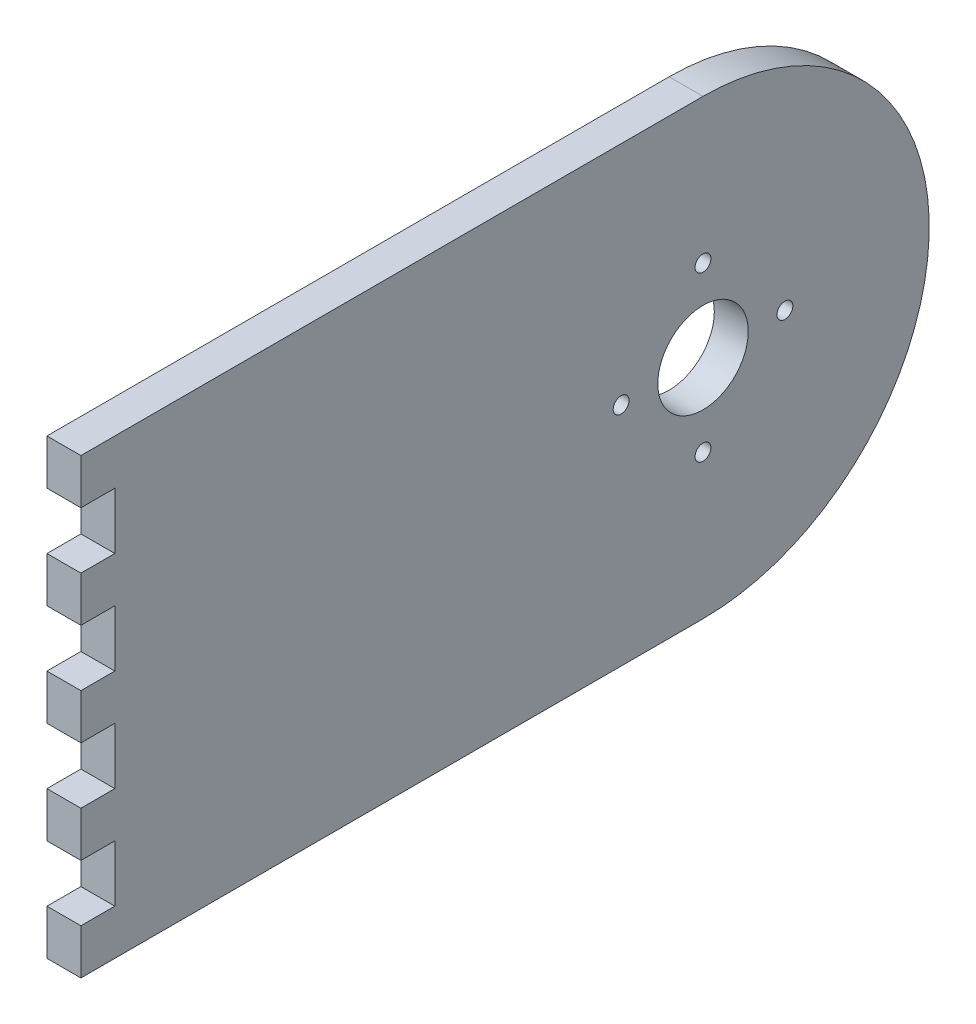
ISO-10303-21;
HEADER;
FILE_DESCRIPTION(('STEP AP214'),'2;1');
FILE_NAME('part.step','',(''),(''),'','','');
FILE_SCHEMA(('AUTOMOTIVE_DESIGN { 1 0 10303 214 1 1 1 1 }'));
ENDSEC;
DATA;
#1=APPLICATION_CONTEXT('core data for automotive mechanical design processes');
#2=APPLICATION_PROTOCOL_DEFINITION('international standard','automotive_design',2000,#1);
#3=PRODUCT_CONTEXT('',#1,'mechanical');
#4=PRODUCT('Part','Part','',(#3));
#5=PRODUCT_RELATED_PRODUCT_CATEGORY('part','',(#4));
#6=PRODUCT_DEFINITION_FORMATION('','',#4);
#7=PRODUCT_DEFINITION_CONTEXT('part definition',#1,'design');
#8=PRODUCT_DEFINITION('design','',#6,#7);
#9=PRODUCT_DEFINITION_SHAPE('','',#8);
#10=(LENGTH_UNIT() NAMED_UNIT(*) SI_UNIT(.MILLI.,.METRE.));
#11=(NAMED_UNIT(*) PLANE_ANGLE_UNIT() SI_UNIT($,.RADIAN.));
#12=(NAMED_UNIT(*) SI_UNIT($,.STERADIAN.) SOLID_ANGLE_UNIT());
#13=UNCERTAINTY_MEASURE_WITH_UNIT(LENGTH_MEASURE(1.E-05),#10,'distance_accuracy_value','');
#14=(GEOMETRIC_REPRESENTATION_CONTEXT(3) GLOBAL_UNCERTAINTY_ASSIGNED_CONTEXT((#13)) GLOBAL_UNIT_ASSIGNED_CONTEXT((#10,
#11,#12)) REPRESENTATION_CONTEXT('',''));
#15=CARTESIAN_POINT('',(0.,0.,0.));
#16=DIRECTION('',(0.,0.,1.));
#17=DIRECTION('',(1.,0.,0.));
#18=AXIS2_PLACEMENT_3D('',#15,#16,#17);
#19=CARTESIAN_POINT('',(3.,0.,0.));
#20=DIRECTION('',(1.,0.,0.));
#21=DIRECTION('',(0.,0.,-1.));
#22=AXIS2_PLACEMENT_3D('',#19,#20,#21);
#23=PLANE('',#22);
#24=CARTESIAN_POINT('',(3.,0.,-7.24));
#25=DIRECTION('',(1.,0.,0.));
#26=DIRECTION('',(0.,0.,-1.));
#27=AXIS2_PLACEMENT_3D('',#24,#25,#26);
#28=CIRCLE('',#27,0.700000000000001);
#29=CARTESIAN_POINT('',(3.,0.,-7.94));
#30=VERTEX_POINT('',#29);
#31=EDGE_CURVE('E400',#30,#30,#28,.T.);
#32=ORIENTED_EDGE('',*,*,#31,.F.);
#33=EDGE_LOOP('',(#32));
#34=FACE_BOUND('',#33,.T.);
#35=CARTESIAN_POINT('',(3.,0.,7.24));
#36=DIRECTION('',(1.,0.,0.));
#37=DIRECTION('',(0.,0.,-1.));
#38=AXIS2_PLACEMENT_3D('',#35,#36,#37);
#39=CIRCLE('',#38,0.7);
#40=CARTESIAN_POINT('',(3.,0.,6.54));
#41=VERTEX_POINT('',#40);
#42=EDGE_CURVE('E412',#41,#41,#39,.T.);
#43=ORIENTED_EDGE('',*,*,#42,.F.);
#44=EDGE_LOOP('',(#43));
#45=FACE_BOUND('',#44,.T.);
#46=DIRECTION('',(0.,0.,-1.));
#47=VECTOR('',#46,1.);
#48=CARTESIAN_POINT('',(3.,16.,55.));
#49=LINE('',#48,#47);
#50=CARTESIAN_POINT('',(3.,16.,55.));
#51=VERTEX_POINT('',#50);
#52=CARTESIAN_POINT('',(3.,16.,52.));
#53=VERTEX_POINT('',#52);
#54=EDGE_CURVE('E241',#51,#53,#49,.T.);
#55=ORIENTED_EDGE('',*,*,#54,.T.);
#56=DIRECTION('',(0.,-1.,0.));
#57=VECTOR('',#56,1.);
#58=CARTESIAN_POINT('',(3.,16.,52.));
#59=LINE('',#58,#57);
#60=CARTESIAN_POINT('',(3.,11.,52.));
#61=VERTEX_POINT('',#60);
#62=EDGE_CURVE('E129',#53,#61,#59,.T.);
#63=ORIENTED_EDGE('',*,*,#62,.T.);
#64=DIRECTION('',(0.,0.,1.));
#65=VECTOR('',#64,1.);
#66=CARTESIAN_POINT('',(3.,11.,52.));
#67=LINE('',#66,#65);
#68=CARTESIAN_POINT('',(3.,11.,55.));
#69=VERTEX_POINT('',#68);
#70=EDGE_CURVE('E292',#61,#69,#67,.T.);
#71=ORIENTED_EDGE('',*,*,#70,.T.);
#72=DIRECTION('',(0.,-1.,0.));
#73=VECTOR('',#72,1.);
#74=CARTESIAN_POINT('',(3.,11.,55.));
#75=LINE('',#74,#73);
#76=CARTESIAN_POINT('',(3.,7.,55.));
#77=VERTEX_POINT('',#76);
#78=EDGE_CURVE('E311',#69,#77,#75,.T.);
#79=ORIENTED_EDGE('',*,*,#78,.T.);
#80=DIRECTION('',(0.,0.,-1.));
#81=VECTOR('',#80,1.);
#82=CARTESIAN_POINT('',(3.,7.,55.));
#83=LINE('',#82,#81);
#84=CARTESIAN_POINT('',(3.,7.,52.));
#85=VERTEX_POINT('',#84);
#86=EDGE_CURVE('E308',#77,#85,#83,.T.);
#87=ORIENTED_EDGE('',*,*,#86,.T.);
#88=DIRECTION('',(0.,-1.,0.));
#89=VECTOR('',#88,1.);
#90=CARTESIAN_POINT('',(3.,7.,52.));
#91=LINE('',#90,#89);
#92=CARTESIAN_POINT('',(3.,2.,52.));
#93=VERTEX_POINT('',#92);
#94=EDGE_CURVE('E310',#85,#93,#91,.T.);
#95=ORIENTED_EDGE('',*,*,#94,.T.);
#96=DIRECTION('',(0.,0.,1.));
#97=VECTOR('',#96,1.);
#98=CARTESIAN_POINT('',(3.,2.,52.));
#99=LINE('',#98,#97);
#100=CARTESIAN_POINT('',(3.,2.,55.));
#101=VERTEX_POINT('',#100);
#102=EDGE_CURVE('E313',#93,#101,#99,.T.);
#103=ORIENTED_EDGE('',*,*,#102,.T.);
#104=DIRECTION('',(0.,-1.,0.));
#105=VECTOR('',#104,1.);
#106=CARTESIAN_POINT('',(3.,2.,55.));
#107=LINE('',#106,#105);
#108=CARTESIAN_POINT('',(3.,-2.,55.));
#109=VERTEX_POINT('',#108);
#110=EDGE_CURVE('E319',#101,#109,#107,.T.);
#111=ORIENTED_EDGE('',*,*,#110,.T.);
#112=DIRECTION('',(0.,0.,-1.));
#113=VECTOR('',#112,1.);
#114=CARTESIAN_POINT('',(3.,-2.,52.));
#115=LINE('',#114,#113);
#116=CARTESIAN_POINT('',(3.,-2.,52.));
#117=VERTEX_POINT('',#116);
#118=EDGE_CURVE('E321',#109,#117,#115,.T.);
#119=ORIENTED_EDGE('',*,*,#118,.T.);
#120=DIRECTION('',(0.,-1.,0.));
#121=VECTOR('',#120,1.);
#122=CARTESIAN_POINT('',(3.,-7.,52.));
#123=LINE('',#122,#121);
#124=CARTESIAN_POINT('',(3.,-7.,52.));
#125=VERTEX_POINT('',#124);
#126=EDGE_CURVE('E323',#117,#125,#123,.T.);
#127=ORIENTED_EDGE('',*,*,#126,.T.);
#128=DIRECTION('',(0.,0.,1.));
#129=VECTOR('',#128,1.);
#130=CARTESIAN_POINT('',(3.,-7.,55.));
#131=LINE('',#130,#129);
#132=CARTESIAN_POINT('',(3.,-7.,55.));
#133=VERTEX_POINT('',#132);
#134=EDGE_CURVE('E325',#125,#133,#131,.T.);
#135=ORIENTED_EDGE('',*,*,#134,.T.);
#136=DIRECTION('',(0.,-1.,0.));
#137=VECTOR('',#136,1.);
#138=CARTESIAN_POINT('',(3.,-7.,55.));
#139=LINE('',#138,#137);
#140=CARTESIAN_POINT('',(3.,-11.,55.));
#141=VERTEX_POINT('',#140);
#142=EDGE_CURVE('E327',#133,#141,#139,.T.);
#143=ORIENTED_EDGE('',*,*,#142,.T.);
#144=DIRECTION('',(0.,0.,-1.));
#145=VECTOR('',#144,1.);
#146=CARTESIAN_POINT('',(3.,-11.,52.));
#147=LINE('',#146,#145);
#148=CARTESIAN_POINT('',(3.,-11.,52.));
#149=VERTEX_POINT('',#148);
#150=EDGE_CURVE('E329',#141,#149,#147,.T.);
#151=ORIENTED_EDGE('',*,*,#150,.T.);
#152=DIRECTION('',(0.,-1.,0.));
#153=VECTOR('',#152,1.);
#154=CARTESIAN_POINT('',(3.,-16.,52.));
#155=LINE('',#154,#153);
#156=CARTESIAN_POINT('',(3.,-16.,52.));
#157=VERTEX_POINT('',#156);
#158=EDGE_CURVE('E331',#149,#157,#155,.T.);
#159=ORIENTED_EDGE('',*,*,#158,.T.);
#160=DIRECTION('',(0.,0.,1.));
#161=VECTOR('',#160,1.);
#162=CARTESIAN_POINT('',(3.,-16.,55.));
#163=LINE('',#162,#161);
#164=CARTESIAN_POINT('',(3.,-16.,55.));
#165=VERTEX_POINT('',#164);
#166=EDGE_CURVE('E333',#157,#165,#163,.T.);
#167=ORIENTED_EDGE('',*,*,#166,.T.);
#168=DIRECTION('',(0.,-1.,0.));
#169=VECTOR('',#168,1.);
#170=CARTESIAN_POINT('',(3.,-16.,55.));
#171=LINE('',#170,#169);
#172=CARTESIAN_POINT('',(3.,-20.,55.));
#173=VERTEX_POINT('',#172);
#174=EDGE_CURVE('E335',#165,#173,#171,.T.);
#175=ORIENTED_EDGE('',*,*,#174,.T.);
#176=DIRECTION('',(0.,0.,-1.));
#177=VECTOR('',#176,1.);
#178=CARTESIAN_POINT('',(3.,-20.,55.));
#179=LINE('',#178,#177);
#180=CARTESIAN_POINT('',(3.,-20.,0.));
#181=VERTEX_POINT('',#180);
#182=EDGE_CURVE('E184',#173,#181,#179,.T.);
#183=ORIENTED_EDGE('',*,*,#182,.T.);
#184=CARTESIAN_POINT('',(3.,0.,0.));
#185=DIRECTION('',(1.,0.,0.));
#186=DIRECTION('',(0.,0.,-1.));
#187=AXIS2_PLACEMENT_3D('',#184,#185,#186);
#188=CIRCLE('',#187,20.);
#189=CARTESIAN_POINT('',(3.,20.,0.));
#190=VERTEX_POINT('',#189);
#191=EDGE_CURVE('E178',#181,#190,#188,.T.);
#192=ORIENTED_EDGE('',*,*,#191,.T.);
#193=DIRECTION('',(0.,0.,1.));
#194=VECTOR('',#193,1.);
#195=CARTESIAN_POINT('',(3.,20.,0.));
#196=LINE('',#195,#194);
#197=CARTESIAN_POINT('',(3.,20.,55.));
#198=VERTEX_POINT('',#197);
#199=EDGE_CURVE('E182',#190,#198,#196,.T.);
#200=ORIENTED_EDGE('',*,*,#199,.T.);
#201=DIRECTION('',(0.,-1.,0.));
#202=VECTOR('',#201,1.);
#203=CARTESIAN_POINT('',(3.,20.,55.));
#204=LINE('',#203,#202);
#205=EDGE_CURVE('E50',#198,#51,#204,.T.);
#206=ORIENTED_EDGE('',*,*,#205,.T.);
#207=EDGE_LOOP('',(#55,#63,#71,#79,#87,#95,#103,#111,#119,#127,#135,#143,#151,#159,#167,#175,
#183,#192,#200,#206));
#208=FACE_BOUND('',#207,.T.);
#209=CARTESIAN_POINT('',(3.,0.,0.));
#210=DIRECTION('',(1.,0.,0.));
#211=DIRECTION('',(0.,0.,-1.));
#212=AXIS2_PLACEMENT_3D('',#209,#210,#211);
#213=CIRCLE('',#212,4.);
#214=CARTESIAN_POINT('',(3.,0.,-4.));
#215=VERTEX_POINT('',#214);
#216=EDGE_CURVE('E206',#215,#215,#213,.T.);
#217=ORIENTED_EDGE('',*,*,#216,.F.);
#218=EDGE_LOOP('',(#217));
#219=FACE_BOUND('',#218,.T.);
#220=CARTESIAN_POINT('',(3.,7.24,0.));
#221=DIRECTION('',(1.,0.,0.));
#222=DIRECTION('',(0.,0.,-1.));
#223=AXIS2_PLACEMENT_3D('',#220,#221,#222);
#224=CIRCLE('',#223,0.7);
#225=CARTESIAN_POINT('',(3.,7.24,-0.699999999999999));
#226=VERTEX_POINT('',#225);
#227=EDGE_CURVE('E406',#226,#226,#224,.T.);
#228=ORIENTED_EDGE('',*,*,#227,.F.);
#229=EDGE_LOOP('',(#228));
#230=FACE_BOUND('',#229,.T.);
#231=CARTESIAN_POINT('',(3.,-7.24,0.));
#232=DIRECTION('',(1.,0.,0.));
#233=DIRECTION('',(0.,0.,-1.));
#234=AXIS2_PLACEMENT_3D('',#231,#232,#233);
#235=CIRCLE('',#234,0.7);
#236=CARTESIAN_POINT('',(3.,-7.24,-0.700000000000001));
#237=VERTEX_POINT('',#236);
#238=EDGE_CURVE('E391',#237,#237,#235,.T.);
#239=ORIENTED_EDGE('',*,*,#238,.F.);
#240=EDGE_LOOP('',(#239));
#241=FACE_BOUND('',#240,.T.);
#242=ADVANCED_FACE('F33',(#34,#45,#208,#219,#230,#241),#23,.T.);
#243=CARTESIAN_POINT('',(0.,0.,0.));
#244=DIRECTION('',(1.,0.,0.));
#245=DIRECTION('',(0.,0.,-1.));
#246=AXIS2_PLACEMENT_3D('',#243,#244,#245);
#247=PLANE('',#246);
#248=CARTESIAN_POINT('',(0.,0.,-7.24));
#249=DIRECTION('',(1.,0.,0.));
#250=DIRECTION('',(0.,0.,-1.));
#251=AXIS2_PLACEMENT_3D('',#248,#249,#250);
#252=CIRCLE('',#251,0.700000000000001);
#253=CARTESIAN_POINT('',(0.,0.,-7.94));
#254=VERTEX_POINT('',#253);
#255=EDGE_CURVE('E397',#254,#254,#252,.T.);
#256=ORIENTED_EDGE('',*,*,#255,.T.);
#257=EDGE_LOOP('',(#256));
#258=FACE_BOUND('',#257,.T.);
#259=CARTESIAN_POINT('',(0.,0.,7.24));
#260=DIRECTION('',(1.,0.,0.));
#261=DIRECTION('',(0.,0.,-1.));
#262=AXIS2_PLACEMENT_3D('',#259,#260,#261);
#263=CIRCLE('',#262,0.7);
#264=CARTESIAN_POINT('',(0.,0.,6.54));
#265=VERTEX_POINT('',#264);
#266=EDGE_CURVE('E409',#265,#265,#263,.T.);
#267=ORIENTED_EDGE('',*,*,#266,.T.);
#268=EDGE_LOOP('',(#267));
#269=FACE_BOUND('',#268,.T.);
#270=DIRECTION('',(0.,0.,-1.));
#271=VECTOR('',#270,1.);
#272=CARTESIAN_POINT('',(0.,16.,55.));
#273=LINE('',#272,#271);
#274=CARTESIAN_POINT('',(0.,16.,55.));
#275=VERTEX_POINT('',#274);
#276=CARTESIAN_POINT('',(0.,16.,52.));
#277=VERTEX_POINT('',#276);
#278=EDGE_CURVE('E202',#275,#277,#273,.T.);
#279=ORIENTED_EDGE('',*,*,#278,.F.);
#280=DIRECTION('',(0.,-1.,0.));
#281=VECTOR('',#280,1.);
#282=CARTESIAN_POINT('',(0.,20.,55.));
#283=LINE('',#282,#281);
#284=CARTESIAN_POINT('',(0.,20.,55.));
#285=VERTEX_POINT('',#284);
#286=EDGE_CURVE('E121',#285,#275,#283,.T.);
#287=ORIENTED_EDGE('',*,*,#286,.F.);
#288=DIRECTION('',(0.,0.,1.));
#289=VECTOR('',#288,1.);
#290=CARTESIAN_POINT('',(0.,20.,0.));
#291=LINE('',#290,#289);
#292=CARTESIAN_POINT('',(0.,20.,0.));
#293=VERTEX_POINT('',#292);
#294=EDGE_CURVE('E115',#293,#285,#291,.T.);
#295=ORIENTED_EDGE('',*,*,#294,.F.);
#296=CARTESIAN_POINT('',(0.,0.,0.));
#297=DIRECTION('',(1.,0.,0.));
#298=DIRECTION('',(0.,0.,-1.));
#299=AXIS2_PLACEMENT_3D('',#296,#297,#298);
#300=CIRCLE('',#299,20.);
#301=CARTESIAN_POINT('',(0.,-20.,0.));
#302=VERTEX_POINT('',#301);
#303=EDGE_CURVE('E192',#302,#293,#300,.T.);
#304=ORIENTED_EDGE('',*,*,#303,.F.);
#305=DIRECTION('',(0.,0.,-1.));
#306=VECTOR('',#305,1.);
#307=CARTESIAN_POINT('',(0.,-20.,55.));
#308=LINE('',#307,#306);
#309=CARTESIAN_POINT('',(0.,-20.,55.));
#310=VERTEX_POINT('',#309);
#311=EDGE_CURVE('E236',#310,#302,#308,.T.);
#312=ORIENTED_EDGE('',*,*,#311,.F.);
#313=DIRECTION('',(0.,-1.,0.));
#314=VECTOR('',#313,1.);
#315=CARTESIAN_POINT('',(0.,-16.,55.));
#316=LINE('',#315,#314);
#317=CARTESIAN_POINT('',(0.,-16.,55.));
#318=VERTEX_POINT('',#317);
#319=EDGE_CURVE('E234',#318,#310,#316,.T.);
#320=ORIENTED_EDGE('',*,*,#319,.F.);
#321=DIRECTION('',(0.,0.,1.));
#322=VECTOR('',#321,1.);
#323=CARTESIAN_POINT('',(0.,-16.,55.));
#324=LINE('',#323,#322);
#325=CARTESIAN_POINT('',(0.,-16.,52.));
#326=VERTEX_POINT('',#325);
#327=EDGE_CURVE('E232',#326,#318,#324,.T.);
#328=ORIENTED_EDGE('',*,*,#327,.F.);
#329=DIRECTION('',(0.,-1.,0.));
#330=VECTOR('',#329,1.);
#331=CARTESIAN_POINT('',(0.,-16.,52.));
#332=LINE('',#331,#330);
#333=CARTESIAN_POINT('',(0.,-11.,52.));
#334=VERTEX_POINT('',#333);
#335=EDGE_CURVE('E230',#334,#326,#332,.T.);
#336=ORIENTED_EDGE('',*,*,#335,.F.);
#337=DIRECTION('',(0.,0.,-1.));
#338=VECTOR('',#337,1.);
#339=CARTESIAN_POINT('',(0.,-11.,52.));
#340=LINE('',#339,#338);
#341=CARTESIAN_POINT('',(0.,-11.,55.));
#342=VERTEX_POINT('',#341);
#343=EDGE_CURVE('E228',#342,#334,#340,.T.);
#344=ORIENTED_EDGE('',*,*,#343,.F.);
#345=DIRECTION('',(0.,-1.,0.));
#346=VECTOR('',#345,1.);
#347=CARTESIAN_POINT('',(0.,-7.,55.));
#348=LINE('',#347,#346);
#349=CARTESIAN_POINT('',(0.,-7.,55.));
#350=VERTEX_POINT('',#349);
#351=EDGE_CURVE('E226',#350,#342,#348,.T.);
#352=ORIENTED_EDGE('',*,*,#351,.F.);
#353=DIRECTION('',(0.,0.,1.));
#354=VECTOR('',#353,1.);
#355=CARTESIAN_POINT('',(0.,-7.,55.));
#356=LINE('',#355,#354);
#357=CARTESIAN_POINT('',(0.,-7.,52.));
#358=VERTEX_POINT('',#357);
#359=EDGE_CURVE('E224',#358,#350,#356,.T.);
#360=ORIENTED_EDGE('',*,*,#359,.F.);
#361=DIRECTION('',(0.,-1.,0.));
#362=VECTOR('',#361,1.);
#363=CARTESIAN_POINT('',(0.,-7.,52.));
#364=LINE('',#363,#362);
#365=CARTESIAN_POINT('',(0.,-2.,52.));
#366=VERTEX_POINT('',#365);
#367=EDGE_CURVE('E222',#366,#358,#364,.T.);
#368=ORIENTED_EDGE('',*,*,#367,.F.);
#369=DIRECTION('',(0.,0.,-1.));
#370=VECTOR('',#369,1.);
#371=CARTESIAN_POINT('',(0.,-2.,52.));
#372=LINE('',#371,#370);
#373=CARTESIAN_POINT('',(0.,-2.,55.));
#374=VERTEX_POINT('',#373);
#375=EDGE_CURVE('E220',#374,#366,#372,.T.);
#376=ORIENTED_EDGE('',*,*,#375,.F.);
#377=DIRECTION('',(0.,-1.,0.));
#378=VECTOR('',#377,1.);
#379=CARTESIAN_POINT('',(0.,2.,55.));
#380=LINE('',#379,#378);
#381=CARTESIAN_POINT('',(0.,2.,55.));
#382=VERTEX_POINT('',#381);
#383=EDGE_CURVE('E218',#382,#374,#380,.T.);
#384=ORIENTED_EDGE('',*,*,#383,.F.);
#385=DIRECTION('',(0.,0.,1.));
#386=VECTOR('',#385,1.);
#387=CARTESIAN_POINT('',(0.,2.,52.));
#388=LINE('',#387,#386);
#389=CARTESIAN_POINT('',(0.,2.,52.));
#390=VERTEX_POINT('',#389);
#391=EDGE_CURVE('E216',#390,#382,#388,.T.);
#392=ORIENTED_EDGE('',*,*,#391,.F.);
#393=DIRECTION('',(0.,-1.,0.));
#394=VECTOR('',#393,1.);
#395=CARTESIAN_POINT('',(0.,7.,52.));
#396=LINE('',#395,#394);
#397=CARTESIAN_POINT('',(0.,7.,52.));
#398=VERTEX_POINT('',#397);
#399=EDGE_CURVE('E214',#398,#390,#396,.T.);
#400=ORIENTED_EDGE('',*,*,#399,.F.);
#401=DIRECTION('',(0.,0.,-1.));
#402=VECTOR('',#401,1.);
#403=CARTESIAN_POINT('',(0.,7.,55.));
#404=LINE('',#403,#402);
#405=CARTESIAN_POINT('',(0.,7.,55.));
#406=VERTEX_POINT('',#405);
#407=EDGE_CURVE('E212',#406,#398,#404,.T.);
#408=ORIENTED_EDGE('',*,*,#407,.F.);
#409=DIRECTION('',(0.,-1.,0.));
#410=VECTOR('',#409,1.);
#411=CARTESIAN_POINT('',(0.,11.,55.));
#412=LINE('',#411,#410);
#413=CARTESIAN_POINT('',(0.,11.,55.));
#414=VERTEX_POINT('',#413);
#415=EDGE_CURVE('E210',#414,#406,#412,.T.);
#416=ORIENTED_EDGE('',*,*,#415,.F.);
#417=DIRECTION('',(0.,0.,1.));
#418=VECTOR('',#417,1.);
#419=CARTESIAN_POINT('',(0.,11.,52.));
#420=LINE('',#419,#418);
#421=CARTESIAN_POINT('',(0.,11.,52.));
#422=VERTEX_POINT('',#421);
#423=EDGE_CURVE('E208',#422,#414,#420,.T.);
#424=ORIENTED_EDGE('',*,*,#423,.F.);
#425=DIRECTION('',(0.,-1.,0.));
#426=VECTOR('',#425,1.);
#427=CARTESIAN_POINT('',(0.,16.,52.));
#428=LINE('',#427,#426);
#429=EDGE_CURVE('E205',#277,#422,#428,.T.);
#430=ORIENTED_EDGE('',*,*,#429,.F.);
#431=EDGE_LOOP('',(#279,#287,#295,#304,#312,#320,#328,#336,#344,#352,#360,#368,#376,#384,#392,
#400,#408,#416,#424,#430));
#432=FACE_BOUND('',#431,.T.);
#433=CARTESIAN_POINT('',(0.,0.,0.));
#434=DIRECTION('',(1.,0.,0.));
#435=DIRECTION('',(0.,0.,-1.));
#436=AXIS2_PLACEMENT_3D('',#433,#434,#435);
#437=CIRCLE('',#436,4.);
#438=CARTESIAN_POINT('',(0.,0.,-4.));
#439=VERTEX_POINT('',#438);
#440=EDGE_CURVE('E415',#439,#439,#437,.T.);
#441=ORIENTED_EDGE('',*,*,#440,.T.);
#442=EDGE_LOOP('',(#441));
#443=FACE_BOUND('',#442,.T.);
#444=CARTESIAN_POINT('',(0.,7.24,0.));
#445=DIRECTION('',(1.,0.,0.));
#446=DIRECTION('',(0.,0.,-1.));
#447=AXIS2_PLACEMENT_3D('',#444,#445,#446);
#448=CIRCLE('',#447,0.7);
#449=CARTESIAN_POINT('',(0.,7.24,-0.699999999999999));
#450=VERTEX_POINT('',#449);
#451=EDGE_CURVE('E403',#450,#450,#448,.T.);
#452=ORIENTED_EDGE('',*,*,#451,.T.);
#453=EDGE_LOOP('',(#452));
#454=FACE_BOUND('',#453,.T.);
#455=CARTESIAN_POINT('',(0.,-7.24,0.));
#456=DIRECTION('',(1.,0.,0.));
#457=DIRECTION('',(0.,0.,-1.));
#458=AXIS2_PLACEMENT_3D('',#455,#456,#457);
#459=CIRCLE('',#458,0.7);
#460=CARTESIAN_POINT('',(0.,-7.24,-0.700000000000001));
#461=VERTEX_POINT('',#460);
#462=EDGE_CURVE('E394',#461,#461,#459,.T.);
#463=ORIENTED_EDGE('',*,*,#462,.T.);
#464=EDGE_LOOP('',(#463));
#465=FACE_BOUND('',#464,.T.);
#466=ADVANCED_FACE('F296',(#258,#269,#432,#443,#454,#465),#247,.F.);
#467=CARTESIAN_POINT('',(3.,16.,55.));
#468=DIRECTION('',(0.,1.,0.));
#469=DIRECTION('',(0.,0.,1.));
#470=AXIS2_PLACEMENT_3D('',#467,#468,#469);
#471=PLANE('',#470);
#472=ORIENTED_EDGE('',*,*,#278,.T.);
#473=DIRECTION('',(-1.,0.,0.));
#474=VECTOR('',#473,1.);
#475=CARTESIAN_POINT('',(3.,16.,52.));
#476=LINE('',#475,#474);
#477=EDGE_CURVE('E11',#53,#277,#476,.T.);
#478=ORIENTED_EDGE('',*,*,#477,.F.);
#479=ORIENTED_EDGE('',*,*,#54,.F.);
#480=DIRECTION('',(-1.,0.,0.));
#481=VECTOR('',#480,1.);
#482=CARTESIAN_POINT('',(3.,16.,55.));
#483=LINE('',#482,#481);
#484=EDGE_CURVE('E198',#51,#275,#483,.T.);
#485=ORIENTED_EDGE('',*,*,#484,.T.);
#486=EDGE_LOOP('',(#472,#478,#479,#485));
#487=FACE_BOUND('',#486,.T.);
#488=ADVANCED_FACE('F35',(#487),#471,.F.);
#489=CARTESIAN_POINT('',(3.,16.,52.));
#490=DIRECTION('',(0.,0.,-1.));
#491=DIRECTION('',(-1.,0.,0.));
#492=AXIS2_PLACEMENT_3D('',#489,#490,#491);
#493=PLANE('',#492);
#494=ORIENTED_EDGE('',*,*,#429,.T.);
#495=DIRECTION('',(-1.,0.,0.));
#496=VECTOR('',#495,1.);
#497=CARTESIAN_POINT('',(3.,11.,52.));
#498=LINE('',#497,#496);
#499=EDGE_CURVE('E42',#61,#422,#498,.T.);
#500=ORIENTED_EDGE('',*,*,#499,.F.);
#501=ORIENTED_EDGE('',*,*,#62,.F.);
#502=ORIENTED_EDGE('',*,*,#477,.T.);
#503=EDGE_LOOP('',(#494,#500,#501,#502));
#504=FACE_BOUND('',#503,.T.);
#505=ADVANCED_FACE('F613',(#504),#493,.F.);
#506=CARTESIAN_POINT('',(3.,11.,52.));
#507=DIRECTION('',(0.,-1.,0.));
#508=DIRECTION('',(0.,0.,-1.));
#509=AXIS2_PLACEMENT_3D('',#506,#507,#508);
#510=PLANE('',#509);
#511=ORIENTED_EDGE('',*,*,#423,.T.);
#512=DIRECTION('',(-1.,0.,0.));
#513=VECTOR('',#512,1.);
#514=CARTESIAN_POINT('',(3.,11.,55.));
#515=LINE('',#514,#513);
#516=EDGE_CURVE('E284',#69,#414,#515,.T.);
#517=ORIENTED_EDGE('',*,*,#516,.F.);
#518=ORIENTED_EDGE('',*,*,#70,.F.);
#519=ORIENTED_EDGE('',*,*,#499,.T.);
#520=EDGE_LOOP('',(#511,#517,#518,#519));
#521=FACE_BOUND('',#520,.T.);
#522=ADVANCED_FACE('F290',(#521),#510,.F.);
#523=CARTESIAN_POINT('',(3.,11.,55.));
#524=DIRECTION('',(0.,0.,-1.));
#525=DIRECTION('',(-1.,0.,0.));
#526=AXIS2_PLACEMENT_3D('',#523,#524,#525);
#527=PLANE('',#526);
#528=ORIENTED_EDGE('',*,*,#415,.T.);
#529=DIRECTION('',(-1.,0.,0.));
#530=VECTOR('',#529,1.);
#531=CARTESIAN_POINT('',(3.,7.,55.));
#532=LINE('',#531,#530);
#533=EDGE_CURVE('E281',#77,#406,#532,.T.);
#534=ORIENTED_EDGE('',*,*,#533,.F.);
#535=ORIENTED_EDGE('',*,*,#78,.F.);
#536=ORIENTED_EDGE('',*,*,#516,.T.);
#537=EDGE_LOOP('',(#528,#534,#535,#536));
#538=FACE_BOUND('',#537,.T.);
#539=ADVANCED_FACE('F302',(#538),#527,.F.);
#540=CARTESIAN_POINT('',(3.,7.,55.));
#541=DIRECTION('',(0.,1.,0.));
#542=DIRECTION('',(0.,0.,1.));
#543=AXIS2_PLACEMENT_3D('',#540,#541,#542);
#544=PLANE('',#543);
#545=ORIENTED_EDGE('',*,*,#407,.T.);
#546=DIRECTION('',(-1.,0.,0.));
#547=VECTOR('',#546,1.);
#548=CARTESIAN_POINT('',(3.,7.,52.));
#549=LINE('',#548,#547);
#550=EDGE_CURVE('E278',#85,#398,#549,.T.);
#551=ORIENTED_EDGE('',*,*,#550,.F.);
#552=ORIENTED_EDGE('',*,*,#86,.F.);
#553=ORIENTED_EDGE('',*,*,#533,.T.);
#554=EDGE_LOOP('',(#545,#551,#552,#553));
#555=FACE_BOUND('',#554,.T.);
#556=ADVANCED_FACE('F306',(#555),#544,.F.);
#557=CARTESIAN_POINT('',(3.,7.,52.));
#558=DIRECTION('',(0.,0.,-1.));
#559=DIRECTION('',(-1.,0.,0.));
#560=AXIS2_PLACEMENT_3D('',#557,#558,#559);
#561=PLANE('',#560);
#562=ORIENTED_EDGE('',*,*,#399,.T.);
#563=DIRECTION('',(-1.,0.,0.));
#564=VECTOR('',#563,1.);
#565=CARTESIAN_POINT('',(3.,2.,52.));
#566=LINE('',#565,#564);
#567=EDGE_CURVE('E275',#93,#390,#566,.T.);
#568=ORIENTED_EDGE('',*,*,#567,.F.);
#569=ORIENTED_EDGE('',*,*,#94,.F.);
#570=ORIENTED_EDGE('',*,*,#550,.T.);
#571=EDGE_LOOP('',(#562,#568,#569,#570));
#572=FACE_BOUND('',#571,.T.);
#573=ADVANCED_FACE('F578',(#572),#561,.F.);
#574=CARTESIAN_POINT('',(3.,2.,52.));
#575=DIRECTION('',(0.,-1.,0.));
#576=DIRECTION('',(0.,0.,-1.));
#577=AXIS2_PLACEMENT_3D('',#574,#575,#576);
#578=PLANE('',#577);
#579=ORIENTED_EDGE('',*,*,#391,.T.);
#580=DIRECTION('',(-1.,0.,0.));
#581=VECTOR('',#580,1.);
#582=CARTESIAN_POINT('',(3.,2.,55.));
#583=LINE('',#582,#581);
#584=EDGE_CURVE('E272',#101,#382,#583,.T.);
#585=ORIENTED_EDGE('',*,*,#584,.F.);
#586=ORIENTED_EDGE('',*,*,#102,.F.);
#587=ORIENTED_EDGE('',*,*,#567,.T.);
#588=EDGE_LOOP('',(#579,#585,#586,#587));
#589=FACE_BOUND('',#588,.T.);
#590=ADVANCED_FACE('F568',(#589),#578,.F.);
#591=CARTESIAN_POINT('',(3.,2.,55.));
#592=DIRECTION('',(0.,0.,-1.));
#593=DIRECTION('',(-1.,0.,0.));
#594=AXIS2_PLACEMENT_3D('',#591,#592,#593);
#595=PLANE('',#594);
#596=ORIENTED_EDGE('',*,*,#383,.T.);
#597=DIRECTION('',(-1.,0.,0.));
#598=VECTOR('',#597,1.);
#599=CARTESIAN_POINT('',(3.,-2.,55.));
#600=LINE('',#599,#598);
#601=EDGE_CURVE('E269',#109,#374,#600,.T.);
#602=ORIENTED_EDGE('',*,*,#601,.F.);
#603=ORIENTED_EDGE('',*,*,#110,.F.);
#604=ORIENTED_EDGE('',*,*,#584,.T.);
#605=EDGE_LOOP('',(#596,#602,#603,#604));
#606=FACE_BOUND('',#605,.T.);
#607=ADVANCED_FACE('F558',(#606),#595,.F.);
#608=CARTESIAN_POINT('',(3.,-2.,52.));
#609=DIRECTION('',(0.,1.,0.));
#610=DIRECTION('',(0.,0.,1.));
#611=AXIS2_PLACEMENT_3D('',#608,#609,#610);
#612=PLANE('',#611);
#613=ORIENTED_EDGE('',*,*,#375,.T.);
#614=DIRECTION('',(-1.,0.,0.));
#615=VECTOR('',#614,1.);
#616=CARTESIAN_POINT('',(3.,-2.,52.));
#617=LINE('',#616,#615);
#618=EDGE_CURVE('E266',#117,#366,#617,.T.);
#619=ORIENTED_EDGE('',*,*,#618,.F.);
#620=ORIENTED_EDGE('',*,*,#118,.F.);
#621=ORIENTED_EDGE('',*,*,#601,.T.);
#622=EDGE_LOOP('',(#613,#619,#620,#621));
#623=FACE_BOUND('',#622,.T.);
#624=ADVANCED_FACE('F548',(#623),#612,.F.);
#625=CARTESIAN_POINT('',(3.,-7.,52.));
#626=DIRECTION('',(0.,0.,-1.));
#627=DIRECTION('',(-1.,0.,0.));
#628=AXIS2_PLACEMENT_3D('',#625,#626,#627);
#629=PLANE('',#628);
#630=ORIENTED_EDGE('',*,*,#367,.T.);
#631=DIRECTION('',(-1.,0.,0.));
#632=VECTOR('',#631,1.);
#633=CARTESIAN_POINT('',(3.,-7.,52.));
#634=LINE('',#633,#632);
#635=EDGE_CURVE('E263',#125,#358,#634,.T.);
#636=ORIENTED_EDGE('',*,*,#635,.F.);
#637=ORIENTED_EDGE('',*,*,#126,.F.);
#638=ORIENTED_EDGE('',*,*,#618,.T.);
#639=EDGE_LOOP('',(#630,#636,#637,#638));
#640=FACE_BOUND('',#639,.T.);
#641=ADVANCED_FACE('F538',(#640),#629,.F.);
#642=CARTESIAN_POINT('',(3.,-7.,55.));
#643=DIRECTION('',(0.,-1.,0.));
#644=DIRECTION('',(0.,0.,-1.));
#645=AXIS2_PLACEMENT_3D('',#642,#643,#644);
#646=PLANE('',#645);
#647=ORIENTED_EDGE('',*,*,#359,.T.);
#648=DIRECTION('',(-1.,0.,0.));
#649=VECTOR('',#648,1.);
#650=CARTESIAN_POINT('',(3.,-7.,55.));
#651=LINE('',#650,#649);
#652=EDGE_CURVE('E260',#133,#350,#651,.T.);
#653=ORIENTED_EDGE('',*,*,#652,.F.);
#654=ORIENTED_EDGE('',*,*,#134,.F.);
#655=ORIENTED_EDGE('',*,*,#635,.T.);
#656=EDGE_LOOP('',(#647,#653,#654,#655));
#657=FACE_BOUND('',#656,.T.);
#658=ADVANCED_FACE('F528',(#657),#646,.F.);
#659=CARTESIAN_POINT('',(3.,-7.,55.));
#660=DIRECTION('',(0.,0.,-1.));
#661=DIRECTION('',(-1.,0.,0.));
#662=AXIS2_PLACEMENT_3D('',#659,#660,#661);
#663=PLANE('',#662);
#664=ORIENTED_EDGE('',*,*,#351,.T.);
#665=DIRECTION('',(-1.,0.,0.));
#666=VECTOR('',#665,1.);
#667=CARTESIAN_POINT('',(3.,-11.,55.));
#668=LINE('',#667,#666);
#669=EDGE_CURVE('E257',#141,#342,#668,.T.);
#670=ORIENTED_EDGE('',*,*,#669,.F.);
#671=ORIENTED_EDGE('',*,*,#142,.F.);
#672=ORIENTED_EDGE('',*,*,#652,.T.);
#673=EDGE_LOOP('',(#664,#670,#671,#672));
#674=FACE_BOUND('',#673,.T.);
#675=ADVANCED_FACE('F518',(#674),#663,.F.);
#676=CARTESIAN_POINT('',(3.,-11.,52.));
#677=DIRECTION('',(0.,1.,0.));
#678=DIRECTION('',(0.,0.,1.));
#679=AXIS2_PLACEMENT_3D('',#676,#677,#678);
#680=PLANE('',#679);
#681=ORIENTED_EDGE('',*,*,#343,.T.);
#682=DIRECTION('',(-1.,0.,0.));
#683=VECTOR('',#682,1.);
#684=CARTESIAN_POINT('',(3.,-11.,52.));
#685=LINE('',#684,#683);
#686=EDGE_CURVE('E254',#149,#334,#685,.T.);
#687=ORIENTED_EDGE('',*,*,#686,.F.);
#688=ORIENTED_EDGE('',*,*,#150,.F.);
#689=ORIENTED_EDGE('',*,*,#669,.T.);
#690=EDGE_LOOP('',(#681,#687,#688,#689));
#691=FACE_BOUND('',#690,.T.);
#692=ADVANCED_FACE('F508',(#691),#680,.F.);
#693=CARTESIAN_POINT('',(3.,-16.,52.));
#694=DIRECTION('',(0.,0.,-1.));
#695=DIRECTION('',(-1.,0.,0.));
#696=AXIS2_PLACEMENT_3D('',#693,#694,#695);
#697=PLANE('',#696);
#698=ORIENTED_EDGE('',*,*,#335,.T.);
#699=DIRECTION('',(-1.,0.,0.));
#700=VECTOR('',#699,1.);
#701=CARTESIAN_POINT('',(3.,-16.,52.));
#702=LINE('',#701,#700);
#703=EDGE_CURVE('E251',#157,#326,#702,.T.);
#704=ORIENTED_EDGE('',*,*,#703,.F.);
#705=ORIENTED_EDGE('',*,*,#158,.F.);
#706=ORIENTED_EDGE('',*,*,#686,.T.);
#707=EDGE_LOOP('',(#698,#704,#705,#706));
#708=FACE_BOUND('',#707,.T.);
#709=ADVANCED_FACE('F498',(#708),#697,.F.);
#710=CARTESIAN_POINT('',(3.,-16.,55.));
#711=DIRECTION('',(0.,-1.,0.));
#712=DIRECTION('',(0.,0.,-1.));
#713=AXIS2_PLACEMENT_3D('',#710,#711,#712);
#714=PLANE('',#713);
#715=ORIENTED_EDGE('',*,*,#327,.T.);
#716=DIRECTION('',(-1.,0.,0.));
#717=VECTOR('',#716,1.);
#718=CARTESIAN_POINT('',(3.,-16.,55.));
#719=LINE('',#718,#717);
#720=EDGE_CURVE('E248',#165,#318,#719,.T.);
#721=ORIENTED_EDGE('',*,*,#720,.F.);
#722=ORIENTED_EDGE('',*,*,#166,.F.);
#723=ORIENTED_EDGE('',*,*,#703,.T.);
#724=EDGE_LOOP('',(#715,#721,#722,#723));
#725=FACE_BOUND('',#724,.T.);
#726=ADVANCED_FACE('F489',(#725),#714,.F.);
#727=CARTESIAN_POINT('',(3.,-16.,55.));
#728=DIRECTION('',(0.,0.,-1.));
#729=DIRECTION('',(-1.,0.,0.));
#730=AXIS2_PLACEMENT_3D('',#727,#728,#729);
#731=PLANE('',#730);
#732=ORIENTED_EDGE('',*,*,#319,.T.);
#733=DIRECTION('',(-1.,0.,0.));
#734=VECTOR('',#733,1.);
#735=CARTESIAN_POINT('',(3.,-20.,55.));
#736=LINE('',#735,#734);
#737=EDGE_CURVE('E245',#173,#310,#736,.T.);
#738=ORIENTED_EDGE('',*,*,#737,.F.);
#739=ORIENTED_EDGE('',*,*,#174,.F.);
#740=ORIENTED_EDGE('',*,*,#720,.T.);
#741=EDGE_LOOP('',(#732,#738,#739,#740));
#742=FACE_BOUND('',#741,.T.);
#743=ADVANCED_FACE('F341',(#742),#731,.F.);
#744=CARTESIAN_POINT('',(3.,-20.,55.));
#745=DIRECTION('',(0.,1.,0.));
#746=DIRECTION('',(0.,0.,1.));
#747=AXIS2_PLACEMENT_3D('',#744,#745,#746);
#748=PLANE('',#747);
#749=ORIENTED_EDGE('',*,*,#311,.T.);
#750=DIRECTION('',(-1.,0.,0.));
#751=VECTOR('',#750,1.);
#752=CARTESIAN_POINT('',(3.,-20.,0.));
#753=LINE('',#752,#751);
#754=EDGE_CURVE('E193',#181,#302,#753,.T.);
#755=ORIENTED_EDGE('',*,*,#754,.F.);
#756=ORIENTED_EDGE('',*,*,#182,.F.);
#757=ORIENTED_EDGE('',*,*,#737,.T.);
#758=EDGE_LOOP('',(#749,#755,#756,#757));
#759=FACE_BOUND('',#758,.T.);
#760=ADVANCED_FACE('F345',(#759),#748,.F.);
#761=CARTESIAN_POINT('',(3.,0.,0.));
#762=DIRECTION('',(-1.,0.,0.));
#763=DIRECTION('',(0.,0.,1.));
#764=AXIS2_PLACEMENT_3D('',#761,#762,#763);
#765=CYLINDRICAL_SURFACE('',#764,20.);
#766=ORIENTED_EDGE('',*,*,#303,.T.);
#767=DIRECTION('',(-1.,0.,0.));
#768=VECTOR('',#767,1.);
#769=CARTESIAN_POINT('',(3.,20.,0.));
#770=LINE('',#769,#768);
#771=EDGE_CURVE('E189',#190,#293,#770,.T.);
#772=ORIENTED_EDGE('',*,*,#771,.F.);
#773=ORIENTED_EDGE('',*,*,#191,.F.);
#774=ORIENTED_EDGE('',*,*,#754,.T.);
#775=EDGE_LOOP('',(#766,#772,#773,#774));
#776=FACE_BOUND('',#775,.T.);
#777=ADVANCED_FACE('F190',(#776),#765,.T.);
#778=CARTESIAN_POINT('',(3.,20.,0.));
#779=DIRECTION('',(0.,-1.,0.));
#780=DIRECTION('',(0.,0.,-1.));
#781=AXIS2_PLACEMENT_3D('',#778,#779,#780);
#782=PLANE('',#781);
#783=ORIENTED_EDGE('',*,*,#294,.T.);
#784=DIRECTION('',(-1.,0.,0.));
#785=VECTOR('',#784,1.);
#786=CARTESIAN_POINT('',(3.,20.,55.));
#787=LINE('',#786,#785);
#788=EDGE_CURVE('E194',#198,#285,#787,.T.);
#789=ORIENTED_EDGE('',*,*,#788,.F.);
#790=ORIENTED_EDGE('',*,*,#199,.F.);
#791=ORIENTED_EDGE('',*,*,#771,.T.);
#792=EDGE_LOOP('',(#783,#789,#790,#791));
#793=FACE_BOUND('',#792,.T.);
#794=ADVANCED_FACE('F196',(#793),#782,.F.);
#795=CARTESIAN_POINT('',(3.,20.,55.));
#796=DIRECTION('',(0.,0.,-1.));
#797=DIRECTION('',(-1.,0.,0.));
#798=AXIS2_PLACEMENT_3D('',#795,#796,#797);
#799=PLANE('',#798);
#800=ORIENTED_EDGE('',*,*,#286,.T.);
#801=ORIENTED_EDGE('',*,*,#484,.F.);
#802=ORIENTED_EDGE('',*,*,#205,.F.);
#803=ORIENTED_EDGE('',*,*,#788,.T.);
#804=EDGE_LOOP('',(#800,#801,#802,#803));
#805=FACE_BOUND('',#804,.T.);
#806=ADVANCED_FACE('F349',(#805),#799,.F.);
#807=CARTESIAN_POINT('',(3.,0.,0.));
#808=DIRECTION('',(-1.,0.,0.));
#809=DIRECTION('',(0.,0.,1.));
#810=AXIS2_PLACEMENT_3D('',#807,#808,#809);
#811=CYLINDRICAL_SURFACE('',#810,4.);
#812=ORIENTED_EDGE('',*,*,#216,.T.);
#813=EDGE_LOOP('',(#812));
#814=FACE_BOUND('',#813,.T.);
#815=ORIENTED_EDGE('',*,*,#440,.F.);
#816=EDGE_LOOP('',(#815));
#817=FACE_BOUND('',#816,.T.);
#818=ADVANCED_FACE('F351',(#814,#817),#811,.F.);
#819=CARTESIAN_POINT('',(3.,0.,7.24));
#820=DIRECTION('',(-1.,0.,0.));
#821=DIRECTION('',(0.,0.,1.));
#822=AXIS2_PLACEMENT_3D('',#819,#820,#821);
#823=CYLINDRICAL_SURFACE('',#822,0.7);
#824=ORIENTED_EDGE('',*,*,#42,.T.);
#825=EDGE_LOOP('',(#824));
#826=FACE_BOUND('',#825,.T.);
#827=ORIENTED_EDGE('',*,*,#266,.F.);
#828=EDGE_LOOP('',(#827));
#829=FACE_BOUND('',#828,.T.);
#830=ADVANCED_FACE('F357',(#826,#829),#823,.F.);
#831=CARTESIAN_POINT('',(3.,7.24,0.));
#832=DIRECTION('',(-1.,0.,0.));
#833=DIRECTION('',(0.,0.,1.));
#834=AXIS2_PLACEMENT_3D('',#831,#832,#833);
#835=CYLINDRICAL_SURFACE('',#834,0.7);
#836=ORIENTED_EDGE('',*,*,#227,.T.);
#837=EDGE_LOOP('',(#836));
#838=FACE_BOUND('',#837,.T.);
#839=ORIENTED_EDGE('',*,*,#451,.F.);
#840=EDGE_LOOP('',(#839));
#841=FACE_BOUND('',#840,.T.);
#842=ADVANCED_FACE('F374',(#838,#841),#835,.F.);
#843=CARTESIAN_POINT('',(3.,0.,-7.24));
#844=DIRECTION('',(-1.,0.,0.));
#845=DIRECTION('',(0.,0.,1.));
#846=AXIS2_PLACEMENT_3D('',#843,#844,#845);
#847=CYLINDRICAL_SURFACE('',#846,0.700000000000001);
#848=ORIENTED_EDGE('',*,*,#31,.T.);
#849=EDGE_LOOP('',(#848));
#850=FACE_BOUND('',#849,.T.);
#851=ORIENTED_EDGE('',*,*,#255,.F.);
#852=EDGE_LOOP('',(#851));
#853=FACE_BOUND('',#852,.T.);
#854=ADVANCED_FACE('F378',(#850,#853),#847,.F.);
#855=CARTESIAN_POINT('',(3.,-7.24,0.));
#856=DIRECTION('',(-1.,0.,0.));
#857=DIRECTION('',(0.,0.,1.));
#858=AXIS2_PLACEMENT_3D('',#855,#856,#857);
#859=CYLINDRICAL_SURFACE('',#858,0.7);
#860=ORIENTED_EDGE('',*,*,#238,.T.);
#861=EDGE_LOOP('',(#860));
#862=FACE_BOUND('',#861,.T.);
#863=ORIENTED_EDGE('',*,*,#462,.F.);
#864=EDGE_LOOP('',(#863));
#865=FACE_BOUND('',#864,.T.);
#866=ADVANCED_FACE('F382',(#862,#865),#859,.F.);
#867=CLOSED_SHELL('',(#242,#466,#488,#505,#522,#539,#556,#573,#590,#607,#624,#641,#658,#675,
#692,#709,#726,#743,#760,#777,#794,#806,#818,#830,#842,#854,#866));
#868=MANIFOLD_SOLID_BREP('B2',#867);
#869=ADVANCED_BREP_SHAPE_REPRESENTATION('',(#18,#868),#14);
#870=SHAPE_DEFINITION_REPRESENTATION(#9,#869);
ENDSEC;
END-ISO-10303-21;
